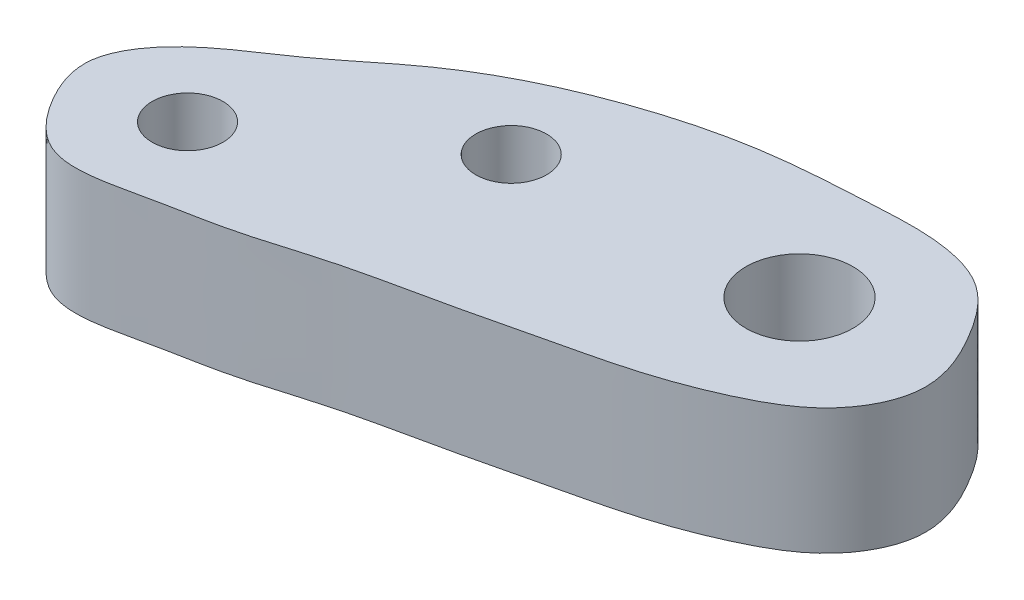
ISO-10303-21;
HEADER;
FILE_DESCRIPTION(('STEP AP214'),'2;1');
FILE_NAME('part.step','',(''),(''),'','','');
FILE_SCHEMA(('AUTOMOTIVE_DESIGN { 1 0 10303 214 1 1 1 1 }'));
ENDSEC;
DATA;
#1=APPLICATION_CONTEXT('core data for automotive mechanical design processes');
#2=APPLICATION_PROTOCOL_DEFINITION('international standard','automotive_design',2000,#1);
#3=PRODUCT_CONTEXT('',#1,'mechanical');
#4=PRODUCT('Part','Part','',(#3));
#5=PRODUCT_RELATED_PRODUCT_CATEGORY('part','',(#4));
#6=PRODUCT_DEFINITION_FORMATION('','',#4);
#7=PRODUCT_DEFINITION_CONTEXT('part definition',#1,'design');
#8=PRODUCT_DEFINITION('design','',#6,#7);
#9=PRODUCT_DEFINITION_SHAPE('','',#8);
#10=(LENGTH_UNIT() NAMED_UNIT(*) SI_UNIT(.MILLI.,.METRE.));
#11=(NAMED_UNIT(*) PLANE_ANGLE_UNIT() SI_UNIT($,.RADIAN.));
#12=(NAMED_UNIT(*) SI_UNIT($,.STERADIAN.) SOLID_ANGLE_UNIT());
#13=UNCERTAINTY_MEASURE_WITH_UNIT(LENGTH_MEASURE(1.E-05),#10,'distance_accuracy_value','');
#14=(GEOMETRIC_REPRESENTATION_CONTEXT(3) GLOBAL_UNCERTAINTY_ASSIGNED_CONTEXT((#13)) GLOBAL_UNIT_ASSIGNED_CONTEXT((#10,
#11,#12)) REPRESENTATION_CONTEXT('',''));
#15=CARTESIAN_POINT('',(0.,0.,0.));
#16=DIRECTION('',(0.,0.,1.));
#17=DIRECTION('',(1.,0.,0.));
#18=AXIS2_PLACEMENT_3D('',#15,#16,#17);
#19=CARTESIAN_POINT('',(1.12247247547149,4.,-43.1962666601767));
#20=DIRECTION('',(0.,1.,0.));
#21=DIRECTION('',(0.,0.,1.));
#22=AXIS2_PLACEMENT_3D('',#19,#20,#21);
#23=PLANE('',#22);
#24=CARTESIAN_POINT('',(-3.11530838018115,4.,-44.6860367612061));
#25=DIRECTION('',(0.,1.,0.));
#26=DIRECTION('',(0.,0.,1.));
#27=AXIS2_PLACEMENT_3D('',#24,#25,#26);
#28=CIRCLE('',#27,1.7);
#29=CARTESIAN_POINT('',(-3.11530838018115,4.,-42.9860367612061));
#30=VERTEX_POINT('',#29);
#31=EDGE_CURVE('E55',#30,#30,#28,.T.);
#32=ORIENTED_EDGE('',*,*,#31,.F.);
#33=EDGE_LOOP('',(#32));
#34=FACE_BOUND('',#33,.T.);
#35=CARTESIAN_POINT('',(-20.223665823373,4.,-41.3457975885407));
#36=CARTESIAN_POINT('',(-20.5546235067439,4.,-40.9443598294612));
#37=CARTESIAN_POINT('',(-21.1628072231114,4.,-39.9043098931203));
#38=CARTESIAN_POINT('',(-20.4926291644849,4.,-38.1653256258617));
#39=CARTESIAN_POINT('',(-18.9629757009815,4.,-36.3857030274924));
#40=CARTESIAN_POINT('',(-16.3498030115779,4.,-37.0866900881345));
#41=CARTESIAN_POINT('',(-13.9290992606867,4.,-37.4725967880886));
#42=CARTESIAN_POINT('',(-11.3934474995995,4.,-38.318859043976));
#43=CARTESIAN_POINT('',(-8.75621868558726,4.,-38.8207922555238));
#44=CARTESIAN_POINT('',(-6.15426269386159,4.,-39.4776142309109));
#45=CARTESIAN_POINT('',(-3.67669130440513,4.,-40.0171567242396));
#46=CARTESIAN_POINT('',(-1.45746846838935,4.,-40.8321557154886));
#47=CARTESIAN_POINT('',(0.545307675021392,4.,-41.9840712423323));
#48=CARTESIAN_POINT('',(1.72343022355133,4.,-44.1538667137636));
#49=CARTESIAN_POINT('',(0.746870916530476,4.,-46.296870071346));
#50=CARTESIAN_POINT('',(-0.625287208233424,4.,-48.1169471971297));
#51=CARTESIAN_POINT('',(-2.66794492439648,4.,-48.5042413345019));
#52=CARTESIAN_POINT('',(-4.96830193836934,4.,-48.3725940409324));
#53=CARTESIAN_POINT('',(-7.8341959264548,4.,-48.2323791850488));
#54=CARTESIAN_POINT('',(-11.5563247023068,4.,-47.255467784623));
#55=CARTESIAN_POINT('',(-14.9986840717245,4.,-45.5966972493308));
#56=CARTESIAN_POINT('',(-17.6935961975272,4.,-43.2143170215346));
#57=CARTESIAN_POINT('',(-19.5135331702796,4.,-42.2071586483699));
#58=CARTESIAN_POINT('',(-20.223665823373,4.,-41.3457975885407));
#59=B_SPLINE_CURVE_WITH_KNOTS('',3,(#35,#36,#37,#38,#39,#40,#41,#42,#43,#44,#45,#46,#47,#48,#49,
#50,#51,#52,#53,#54,#55,#56,#57,#58),.UNSPECIFIED.,.T.,.F.,(4,1,1,1,1,1,1,1,1,1,1,1,1,1,1,1,1,1,
1,1,1,4),(0.,0.0283250086710214,0.062265705106833,0.0967404993422359,0.148970662712024,
0.194497578373864,0.238489073484969,0.29677020920176,0.344853736118058,0.388504988206138,
0.438460059289034,0.476617868669526,0.516330223246,0.562496307456637,0.598457783342924,
0.640195194373018,0.670637842581483,0.728639356185856,0.799615611394092,0.884792360497132,
0.939223306884522,1.),.UNSPECIFIED.);
#60=CARTESIAN_POINT('',(-20.223665823373,4.,-41.3457975885407));
#61=VERTEX_POINT('',#60);
#62=EDGE_CURVE('E10',#61,#61,#59,.T.);
#63=ORIENTED_EDGE('',*,*,#62,.T.);
#64=EDGE_LOOP('',(#63));
#65=FACE_BOUND('',#64,.T.);
#66=CARTESIAN_POINT('',(-11.6313372477777,4.,-44.0427228223967));
#67=DIRECTION('',(0.,1.,0.));
#68=DIRECTION('',(0.,0.,1.));
#69=AXIS2_PLACEMENT_3D('',#66,#67,#68);
#70=CIRCLE('',#69,1.125);
#71=CARTESIAN_POINT('',(-11.6313372477777,4.,-42.9177228223967));
#72=VERTEX_POINT('',#71);
#73=EDGE_CURVE('E44',#72,#72,#70,.T.);
#74=ORIENTED_EDGE('',*,*,#73,.F.);
#75=EDGE_LOOP('',(#74));
#76=FACE_BOUND('',#75,.T.);
#77=CARTESIAN_POINT('',(-17.668644026557,4.,-39.7976908031055));
#78=DIRECTION('',(0.,1.,0.));
#79=DIRECTION('',(0.,0.,1.));
#80=AXIS2_PLACEMENT_3D('',#77,#78,#79);
#81=CIRCLE('',#80,1.125);
#82=CARTESIAN_POINT('',(-17.668644026557,4.,-38.6726908031055));
#83=VERTEX_POINT('',#82);
#84=EDGE_CURVE('E61',#83,#83,#81,.T.);
#85=ORIENTED_EDGE('',*,*,#84,.F.);
#86=EDGE_LOOP('',(#85));
#87=FACE_BOUND('',#86,.T.);
#88=ADVANCED_FACE('F31',(#34,#65,#76,#87),#23,.T.);
#89=CARTESIAN_POINT('',(1.12247247547149,0.,-43.1962666601767));
#90=DIRECTION('',(0.,1.,0.));
#91=DIRECTION('',(0.,0.,1.));
#92=AXIS2_PLACEMENT_3D('',#89,#90,#91);
#93=PLANE('',#92);
#94=CARTESIAN_POINT('',(-20.223665823373,0.,-41.3457975885407));
#95=CARTESIAN_POINT('',(-20.5546235067439,0.,-40.9443598294612));
#96=CARTESIAN_POINT('',(-21.1628072231114,0.,-39.9043098931203));
#97=CARTESIAN_POINT('',(-20.4926291644849,0.,-38.1653256258617));
#98=CARTESIAN_POINT('',(-18.9629757009815,0.,-36.3857030274924));
#99=CARTESIAN_POINT('',(-16.3498030115779,0.,-37.0866900881345));
#100=CARTESIAN_POINT('',(-13.9290992606867,0.,-37.4725967880886));
#101=CARTESIAN_POINT('',(-11.3934474995995,0.,-38.318859043976));
#102=CARTESIAN_POINT('',(-8.75621868558726,0.,-38.8207922555238));
#103=CARTESIAN_POINT('',(-6.15426269386159,0.,-39.4776142309109));
#104=CARTESIAN_POINT('',(-3.67669130440513,0.,-40.0171567242396));
#105=CARTESIAN_POINT('',(-1.45746846838935,0.,-40.8321557154886));
#106=CARTESIAN_POINT('',(0.545307675021392,0.,-41.9840712423323));
#107=CARTESIAN_POINT('',(1.72343022355133,0.,-44.1538667137636));
#108=CARTESIAN_POINT('',(0.746870916530476,0.,-46.296870071346));
#109=CARTESIAN_POINT('',(-0.625287208233424,0.,-48.1169471971297));
#110=CARTESIAN_POINT('',(-2.66794492439648,0.,-48.5042413345019));
#111=CARTESIAN_POINT('',(-4.96830193836934,0.,-48.3725940409324));
#112=CARTESIAN_POINT('',(-7.8341959264548,0.,-48.2323791850488));
#113=CARTESIAN_POINT('',(-11.5563247023068,0.,-47.255467784623));
#114=CARTESIAN_POINT('',(-14.9986840717245,0.,-45.5966972493308));
#115=CARTESIAN_POINT('',(-17.6935961975272,0.,-43.2143170215346));
#116=CARTESIAN_POINT('',(-19.5135331702796,0.,-42.2071586483699));
#117=CARTESIAN_POINT('',(-20.223665823373,0.,-41.3457975885407));
#118=B_SPLINE_CURVE_WITH_KNOTS('',3,(#94,#95,#96,#97,#98,#99,#100,#101,#102,#103,#104,#105,#106,
#107,#108,#109,#110,#111,#112,#113,#114,#115,#116,#117),.UNSPECIFIED.,.T.,.F.,(4,1,1,1,1,1,1,1,
1,1,1,1,1,1,1,1,1,1,1,1,1,4),(0.,0.0283250086710214,0.062265705106833,0.0967404993422359,
0.148970662712024,0.194497578373864,0.238489073484969,0.29677020920176,0.344853736118058,
0.388504988206138,0.438460059289034,0.476617868669526,0.516330223246,0.562496307456637,
0.598457783342924,0.640195194373018,0.670637842581483,0.728639356185856,0.799615611394092,
0.884792360497132,0.939223306884522,1.),.UNSPECIFIED.);
#119=CARTESIAN_POINT('',(-20.223665823373,0.,-41.3457975885407));
#120=VERTEX_POINT('',#119);
#121=EDGE_CURVE('E36',#120,#120,#118,.T.);
#122=ORIENTED_EDGE('',*,*,#121,.F.);
#123=EDGE_LOOP('',(#122));
#124=FACE_BOUND('',#123,.T.);
#125=CARTESIAN_POINT('',(-11.6313372477777,0.,-44.0427228223967));
#126=DIRECTION('',(0.,1.,0.));
#127=DIRECTION('',(0.,0.,1.));
#128=AXIS2_PLACEMENT_3D('',#125,#126,#127);
#129=CIRCLE('',#128,1.125);
#130=CARTESIAN_POINT('',(-11.6313372477777,0.,-42.9177228223967));
#131=VERTEX_POINT('',#130);
#132=EDGE_CURVE('E49',#131,#131,#129,.T.);
#133=ORIENTED_EDGE('',*,*,#132,.T.);
#134=EDGE_LOOP('',(#133));
#135=FACE_BOUND('',#134,.T.);
#136=CARTESIAN_POINT('',(-3.11530838018115,0.,-44.6860367612061));
#137=DIRECTION('',(0.,1.,0.));
#138=DIRECTION('',(0.,0.,1.));
#139=AXIS2_PLACEMENT_3D('',#136,#137,#138);
#140=CIRCLE('',#139,1.7);
#141=CARTESIAN_POINT('',(-3.11530838018115,0.,-42.9860367612061));
#142=VERTEX_POINT('',#141);
#143=EDGE_CURVE('E58',#142,#142,#140,.T.);
#144=ORIENTED_EDGE('',*,*,#143,.T.);
#145=EDGE_LOOP('',(#144));
#146=FACE_BOUND('',#145,.T.);
#147=CARTESIAN_POINT('',(-17.668644026557,0.,-39.7976908031055));
#148=DIRECTION('',(0.,1.,0.));
#149=DIRECTION('',(0.,0.,1.));
#150=AXIS2_PLACEMENT_3D('',#147,#148,#149);
#151=CIRCLE('',#150,1.125);
#152=CARTESIAN_POINT('',(-17.668644026557,0.,-38.6726908031055));
#153=VERTEX_POINT('',#152);
#154=EDGE_CURVE('E64',#153,#153,#151,.T.);
#155=ORIENTED_EDGE('',*,*,#154,.T.);
#156=EDGE_LOOP('',(#155));
#157=FACE_BOUND('',#156,.T.);
#158=ADVANCED_FACE('F74',(#124,#135,#146,#157),#93,.F.);
#159=DIRECTION('',(0.,-1.,0.));
#160=VECTOR('',#159,1.);
#161=SURFACE_OF_LINEAR_EXTRUSION('',#59,#160);
#162=ORIENTED_EDGE('',*,*,#62,.F.);
#163=EDGE_LOOP('',(#162));
#164=FACE_BOUND('',#163,.T.);
#165=ORIENTED_EDGE('',*,*,#121,.T.);
#166=EDGE_LOOP('',(#165));
#167=FACE_BOUND('',#166,.T.);
#168=ADVANCED_FACE('F33',(#164,#167),#161,.F.);
#169=CARTESIAN_POINT('',(-11.6313372477777,4.,-44.0427228223967));
#170=DIRECTION('',(0.,-1.,0.));
#171=DIRECTION('',(0.,0.,-1.));
#172=AXIS2_PLACEMENT_3D('',#169,#170,#171);
#173=CYLINDRICAL_SURFACE('',#172,1.125);
#174=ORIENTED_EDGE('',*,*,#73,.T.);
#175=EDGE_LOOP('',(#174));
#176=FACE_BOUND('',#175,.T.);
#177=ORIENTED_EDGE('',*,*,#132,.F.);
#178=EDGE_LOOP('',(#177));
#179=FACE_BOUND('',#178,.T.);
#180=ADVANCED_FACE('F83',(#176,#179),#173,.F.);
#181=CARTESIAN_POINT('',(-3.11530838018115,4.,-44.6860367612061));
#182=DIRECTION('',(0.,-1.,0.));
#183=DIRECTION('',(0.,0.,-1.));
#184=AXIS2_PLACEMENT_3D('',#181,#182,#183);
#185=CYLINDRICAL_SURFACE('',#184,1.7);
#186=ORIENTED_EDGE('',*,*,#31,.T.);
#187=EDGE_LOOP('',(#186));
#188=FACE_BOUND('',#187,.T.);
#189=ORIENTED_EDGE('',*,*,#143,.F.);
#190=EDGE_LOOP('',(#189));
#191=FACE_BOUND('',#190,.T.);
#192=ADVANCED_FACE('F86',(#188,#191),#185,.F.);
#193=CARTESIAN_POINT('',(-17.668644026557,4.,-39.7976908031055));
#194=DIRECTION('',(0.,-1.,0.));
#195=DIRECTION('',(0.,0.,-1.));
#196=AXIS2_PLACEMENT_3D('',#193,#194,#195);
#197=CYLINDRICAL_SURFACE('',#196,1.125);
#198=ORIENTED_EDGE('',*,*,#84,.T.);
#199=EDGE_LOOP('',(#198));
#200=FACE_BOUND('',#199,.T.);
#201=ORIENTED_EDGE('',*,*,#154,.F.);
#202=EDGE_LOOP('',(#201));
#203=FACE_BOUND('',#202,.T.);
#204=ADVANCED_FACE('F70',(#200,#203),#197,.F.);
#205=CLOSED_SHELL('',(#88,#158,#168,#180,#192,#204));
#206=MANIFOLD_SOLID_BREP('B2',#205);
#207=ADVANCED_BREP_SHAPE_REPRESENTATION('',(#18,#206),#14);
#208=SHAPE_DEFINITION_REPRESENTATION(#9,#207);
ENDSEC;
END-ISO-10303-21;
